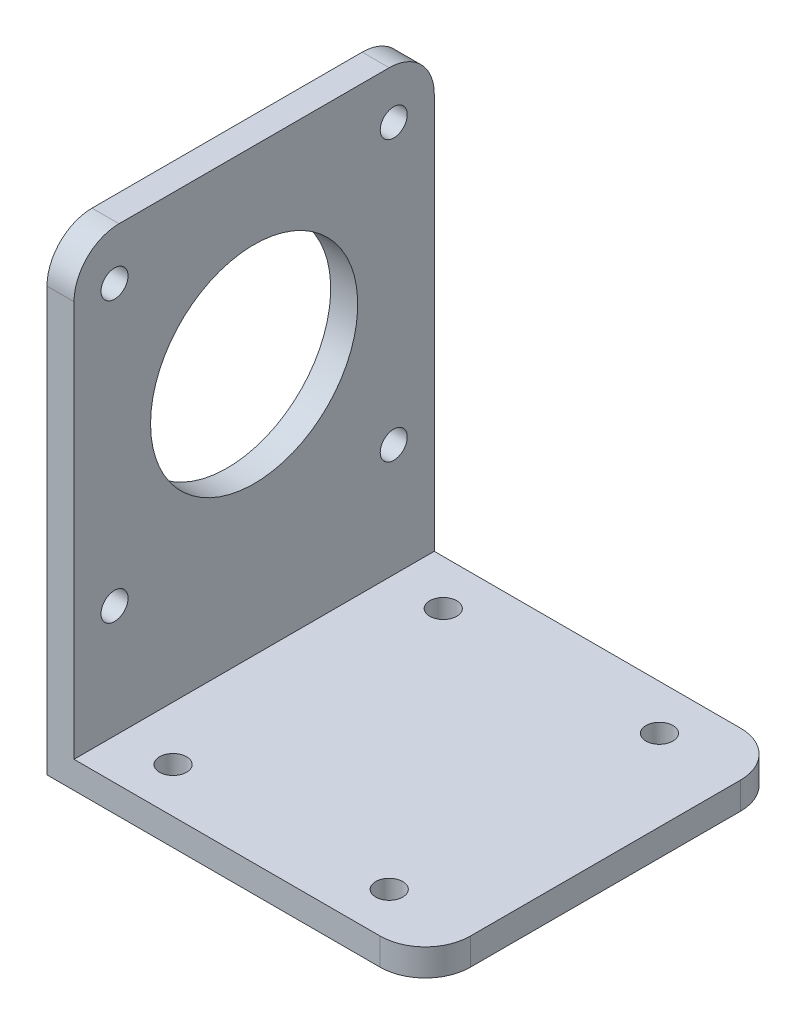
ISO-10303-21;
HEADER;
FILE_DESCRIPTION(('STEP AP214'),'2;1');
FILE_NAME('part.step','',(''),(''),'','','');
FILE_SCHEMA(('AUTOMOTIVE_DESIGN { 1 0 10303 214 1 1 1 1 }'));
ENDSEC;
DATA;
#1=APPLICATION_CONTEXT('core data for automotive mechanical design processes');
#2=APPLICATION_PROTOCOL_DEFINITION('international standard','automotive_design',2000,#1);
#3=PRODUCT_CONTEXT('',#1,'mechanical');
#4=PRODUCT('Part','Part','',(#3));
#5=PRODUCT_RELATED_PRODUCT_CATEGORY('part','',(#4));
#6=PRODUCT_DEFINITION_FORMATION('','',#4);
#7=PRODUCT_DEFINITION_CONTEXT('part definition',#1,'design');
#8=PRODUCT_DEFINITION('design','',#6,#7);
#9=PRODUCT_DEFINITION_SHAPE('','',#8);
#10=(LENGTH_UNIT() NAMED_UNIT(*) SI_UNIT(.MILLI.,.METRE.));
#11=(NAMED_UNIT(*) PLANE_ANGLE_UNIT() SI_UNIT($,.RADIAN.));
#12=(NAMED_UNIT(*) SI_UNIT($,.STERADIAN.) SOLID_ANGLE_UNIT());
#13=UNCERTAINTY_MEASURE_WITH_UNIT(LENGTH_MEASURE(1.E-05),#10,'distance_accuracy_value','');
#14=(GEOMETRIC_REPRESENTATION_CONTEXT(3) GLOBAL_UNCERTAINTY_ASSIGNED_CONTEXT((#13)) GLOBAL_UNIT_ASSIGNED_CONTEXT((#10,
#11,#12)) REPRESENTATION_CONTEXT('',''));
#15=CARTESIAN_POINT('',(0.,0.,0.));
#16=DIRECTION('',(0.,0.,1.));
#17=DIRECTION('',(1.,0.,0.));
#18=AXIS2_PLACEMENT_3D('',#15,#16,#17);
#19=CARTESIAN_POINT('',(0.,3.,0.));
#20=DIRECTION('',(0.,-1.,0.));
#21=DIRECTION('',(0.,0.,-1.));
#22=AXIS2_PLACEMENT_3D('',#19,#20,#21);
#23=PLANE('',#22);
#24=DIRECTION('',(0.,0.,-1.));
#25=VECTOR('',#24,1.);
#26=CARTESIAN_POINT('',(21.,3.,20.));
#27=LINE('',#26,#25);
#28=CARTESIAN_POINT('',(21.,3.,15.));
#29=VERTEX_POINT('',#28);
#30=CARTESIAN_POINT('',(21.,3.,-15.));
#31=VERTEX_POINT('',#30);
#32=EDGE_CURVE('E130',#29,#31,#27,.T.);
#33=ORIENTED_EDGE('',*,*,#32,.T.);
#34=CARTESIAN_POINT('',(16.,3.,-15.));
#35=DIRECTION('',(0.,-1.,0.));
#36=DIRECTION('',(0.,0.,-1.));
#37=AXIS2_PLACEMENT_3D('',#34,#35,#36);
#38=CIRCLE('',#37,5.);
#39=CARTESIAN_POINT('',(16.,3.,-20.));
#40=VERTEX_POINT('',#39);
#41=EDGE_CURVE('E49',#31,#40,#38,.F.);
#42=ORIENTED_EDGE('',*,*,#41,.T.);
#43=DIRECTION('',(-1.,0.,0.));
#44=VECTOR('',#43,1.);
#45=CARTESIAN_POINT('',(-21.,3.,-20.));
#46=LINE('',#45,#44);
#47=CARTESIAN_POINT('',(-18.,3.,-20.));
#48=VERTEX_POINT('',#47);
#49=EDGE_CURVE('E120',#40,#48,#46,.T.);
#50=ORIENTED_EDGE('',*,*,#49,.T.);
#51=DIRECTION('',(0.,0.,1.));
#52=VECTOR('',#51,1.);
#53=CARTESIAN_POINT('',(-18.,3.,-20.));
#54=LINE('',#53,#52);
#55=CARTESIAN_POINT('',(-18.,3.,20.));
#56=VERTEX_POINT('',#55);
#57=EDGE_CURVE('E124',#48,#56,#54,.T.);
#58=ORIENTED_EDGE('',*,*,#57,.T.);
#59=DIRECTION('',(1.,0.,0.));
#60=VECTOR('',#59,1.);
#61=CARTESIAN_POINT('',(-21.,3.,20.));
#62=LINE('',#61,#60);
#63=CARTESIAN_POINT('',(16.,3.,20.));
#64=VERTEX_POINT('',#63);
#65=EDGE_CURVE('E129',#56,#64,#62,.T.);
#66=ORIENTED_EDGE('',*,*,#65,.T.);
#67=CARTESIAN_POINT('',(16.,3.,15.));
#68=DIRECTION('',(0.,-1.,0.));
#69=DIRECTION('',(0.,0.,-1.));
#70=AXIS2_PLACEMENT_3D('',#67,#68,#69);
#71=CIRCLE('',#70,5.);
#72=EDGE_CURVE('E224',#64,#29,#71,.F.);
#73=ORIENTED_EDGE('',*,*,#72,.T.);
#74=EDGE_LOOP('',(#33,#42,#50,#58,#66,#73));
#75=FACE_BOUND('',#74,.T.);
#76=CARTESIAN_POINT('',(-12.,3.,-15.));
#77=DIRECTION('',(0.,1.,0.));
#78=DIRECTION('',(0.,0.,1.));
#79=AXIS2_PLACEMENT_3D('',#76,#77,#78);
#80=CIRCLE('',#79,1.5);
#81=CARTESIAN_POINT('',(-12.,3.,-13.5));
#82=VERTEX_POINT('',#81);
#83=EDGE_CURVE('E176',#82,#82,#80,.T.);
#84=ORIENTED_EDGE('',*,*,#83,.F.);
#85=EDGE_LOOP('',(#84));
#86=FACE_BOUND('',#85,.T.);
#87=CARTESIAN_POINT('',(-12.,3.,15.));
#88=DIRECTION('',(0.,1.,0.));
#89=DIRECTION('',(0.,0.,-1.));
#90=AXIS2_PLACEMENT_3D('',#87,#88,#89);
#91=CIRCLE('',#90,1.5);
#92=CARTESIAN_POINT('',(-12.,3.,13.5));
#93=VERTEX_POINT('',#92);
#94=EDGE_CURVE('E170',#93,#93,#91,.T.);
#95=ORIENTED_EDGE('',*,*,#94,.F.);
#96=EDGE_LOOP('',(#95));
#97=FACE_BOUND('',#96,.T.);
#98=CARTESIAN_POINT('',(12.,3.,15.));
#99=DIRECTION('',(0.,1.,0.));
#100=DIRECTION('',(0.,0.,1.));
#101=AXIS2_PLACEMENT_3D('',#98,#99,#100);
#102=CIRCLE('',#101,1.5);
#103=CARTESIAN_POINT('',(12.,3.,16.5));
#104=VERTEX_POINT('',#103);
#105=EDGE_CURVE('E164',#104,#104,#102,.T.);
#106=ORIENTED_EDGE('',*,*,#105,.F.);
#107=EDGE_LOOP('',(#106));
#108=FACE_BOUND('',#107,.T.);
#109=CARTESIAN_POINT('',(12.,3.,-15.));
#110=DIRECTION('',(0.,1.,0.));
#111=DIRECTION('',(0.,0.,-1.));
#112=AXIS2_PLACEMENT_3D('',#109,#110,#111);
#113=CIRCLE('',#112,1.5);
#114=CARTESIAN_POINT('',(12.,3.,-16.5));
#115=VERTEX_POINT('',#114);
#116=EDGE_CURVE('E158',#115,#115,#113,.T.);
#117=ORIENTED_EDGE('',*,*,#116,.F.);
#118=EDGE_LOOP('',(#117));
#119=FACE_BOUND('',#118,.T.);
#120=ADVANCED_FACE('F41',(#75,#86,#97,#108,#119),#23,.F.);
#121=CARTESIAN_POINT('',(0.,0.,0.));
#122=DIRECTION('',(0.,-1.,0.));
#123=DIRECTION('',(0.,0.,-1.));
#124=AXIS2_PLACEMENT_3D('',#121,#122,#123);
#125=PLANE('',#124);
#126=CARTESIAN_POINT('',(12.,0.,15.));
#127=DIRECTION('',(0.,1.,0.));
#128=DIRECTION('',(0.,0.,1.));
#129=AXIS2_PLACEMENT_3D('',#126,#127,#128);
#130=CIRCLE('',#129,1.5);
#131=CARTESIAN_POINT('',(12.,0.,16.5));
#132=VERTEX_POINT('',#131);
#133=EDGE_CURVE('E161',#132,#132,#130,.T.);
#134=ORIENTED_EDGE('',*,*,#133,.T.);
#135=EDGE_LOOP('',(#134));
#136=FACE_BOUND('',#135,.T.);
#137=CARTESIAN_POINT('',(-12.,0.,-15.));
#138=DIRECTION('',(0.,1.,0.));
#139=DIRECTION('',(0.,0.,1.));
#140=AXIS2_PLACEMENT_3D('',#137,#138,#139);
#141=CIRCLE('',#140,1.5);
#142=CARTESIAN_POINT('',(-12.,0.,-13.5));
#143=VERTEX_POINT('',#142);
#144=EDGE_CURVE('E173',#143,#143,#141,.T.);
#145=ORIENTED_EDGE('',*,*,#144,.T.);
#146=EDGE_LOOP('',(#145));
#147=FACE_BOUND('',#146,.T.);
#148=DIRECTION('',(-1.,0.,0.));
#149=VECTOR('',#148,1.);
#150=CARTESIAN_POINT('',(-21.,0.,-20.));
#151=LINE('',#150,#149);
#152=CARTESIAN_POINT('',(16.,0.,-20.));
#153=VERTEX_POINT('',#152);
#154=CARTESIAN_POINT('',(-21.,0.,-20.));
#155=VERTEX_POINT('',#154);
#156=EDGE_CURVE('E187',#153,#155,#151,.T.);
#157=ORIENTED_EDGE('',*,*,#156,.F.);
#158=CARTESIAN_POINT('',(16.,0.,-15.));
#159=DIRECTION('',(0.,-1.,0.));
#160=DIRECTION('',(0.,0.,-1.));
#161=AXIS2_PLACEMENT_3D('',#158,#159,#160);
#162=CIRCLE('',#161,5.);
#163=CARTESIAN_POINT('',(21.,0.,-15.));
#164=VERTEX_POINT('',#163);
#165=EDGE_CURVE('E218',#153,#164,#162,.T.);
#166=ORIENTED_EDGE('',*,*,#165,.T.);
#167=DIRECTION('',(0.,0.,-1.));
#168=VECTOR('',#167,1.);
#169=CARTESIAN_POINT('',(21.,0.,20.));
#170=LINE('',#169,#168);
#171=CARTESIAN_POINT('',(21.,0.,15.));
#172=VERTEX_POINT('',#171);
#173=EDGE_CURVE('E179',#172,#164,#170,.T.);
#174=ORIENTED_EDGE('',*,*,#173,.F.);
#175=CARTESIAN_POINT('',(16.,0.,15.));
#176=DIRECTION('',(0.,-1.,0.));
#177=DIRECTION('',(0.,0.,-1.));
#178=AXIS2_PLACEMENT_3D('',#175,#176,#177);
#179=CIRCLE('',#178,5.);
#180=CARTESIAN_POINT('',(16.,0.,20.));
#181=VERTEX_POINT('',#180);
#182=EDGE_CURVE('E216',#172,#181,#179,.T.);
#183=ORIENTED_EDGE('',*,*,#182,.T.);
#184=DIRECTION('',(1.,0.,0.));
#185=VECTOR('',#184,1.);
#186=CARTESIAN_POINT('',(-21.,0.,20.));
#187=LINE('',#186,#185);
#188=CARTESIAN_POINT('',(-21.,0.,20.));
#189=VERTEX_POINT('',#188);
#190=EDGE_CURVE('E182',#189,#181,#187,.T.);
#191=ORIENTED_EDGE('',*,*,#190,.F.);
#192=DIRECTION('',(0.,0.,1.));
#193=VECTOR('',#192,1.);
#194=CARTESIAN_POINT('',(-21.,0.,20.));
#195=LINE('',#194,#193);
#196=EDGE_CURVE('E189',#155,#189,#195,.T.);
#197=ORIENTED_EDGE('',*,*,#196,.F.);
#198=EDGE_LOOP('',(#157,#166,#174,#183,#191,#197));
#199=FACE_BOUND('',#198,.T.);
#200=CARTESIAN_POINT('',(-12.,0.,15.));
#201=DIRECTION('',(0.,1.,0.));
#202=DIRECTION('',(0.,0.,-1.));
#203=AXIS2_PLACEMENT_3D('',#200,#201,#202);
#204=CIRCLE('',#203,1.5);
#205=CARTESIAN_POINT('',(-12.,0.,13.5));
#206=VERTEX_POINT('',#205);
#207=EDGE_CURVE('E167',#206,#206,#204,.T.);
#208=ORIENTED_EDGE('',*,*,#207,.T.);
#209=EDGE_LOOP('',(#208));
#210=FACE_BOUND('',#209,.T.);
#211=CARTESIAN_POINT('',(12.,0.,-15.));
#212=DIRECTION('',(0.,1.,0.));
#213=DIRECTION('',(0.,0.,-1.));
#214=AXIS2_PLACEMENT_3D('',#211,#212,#213);
#215=CIRCLE('',#214,1.5);
#216=CARTESIAN_POINT('',(12.,0.,-16.5));
#217=VERTEX_POINT('',#216);
#218=EDGE_CURVE('E140',#217,#217,#215,.T.);
#219=ORIENTED_EDGE('',*,*,#218,.T.);
#220=EDGE_LOOP('',(#219));
#221=FACE_BOUND('',#220,.T.);
#222=ADVANCED_FACE('F233',(#136,#147,#199,#210,#221),#125,.T.);
#223=CARTESIAN_POINT('',(21.,3.,20.));
#224=DIRECTION('',(-1.,0.,0.));
#225=DIRECTION('',(0.,0.,1.));
#226=AXIS2_PLACEMENT_3D('',#223,#224,#225);
#227=PLANE('',#226);
#228=ORIENTED_EDGE('',*,*,#173,.T.);
#229=DIRECTION('',(0.,-1.,0.));
#230=VECTOR('',#229,1.);
#231=CARTESIAN_POINT('',(21.,3.,-15.));
#232=LINE('',#231,#230);
#233=EDGE_CURVE('E62',#164,#31,#232,.F.);
#234=ORIENTED_EDGE('',*,*,#233,.T.);
#235=ORIENTED_EDGE('',*,*,#32,.F.);
#236=DIRECTION('',(0.,-1.,0.));
#237=VECTOR('',#236,1.);
#238=CARTESIAN_POINT('',(21.,3.,15.));
#239=LINE('',#238,#237);
#240=EDGE_CURVE('E220',#29,#172,#239,.T.);
#241=ORIENTED_EDGE('',*,*,#240,.T.);
#242=EDGE_LOOP('',(#228,#234,#235,#241));
#243=FACE_BOUND('',#242,.T.);
#244=ADVANCED_FACE('F228',(#243),#227,.F.);
#245=CARTESIAN_POINT('',(-21.,3.,-20.));
#246=DIRECTION('',(0.,0.,1.));
#247=DIRECTION('',(1.,0.,0.));
#248=AXIS2_PLACEMENT_3D('',#245,#246,#247);
#249=PLANE('',#248);
#250=ORIENTED_EDGE('',*,*,#49,.F.);
#251=DIRECTION('',(0.,-1.,0.));
#252=VECTOR('',#251,1.);
#253=CARTESIAN_POINT('',(16.,3.,-20.));
#254=LINE('',#253,#252);
#255=EDGE_CURVE('E214',#40,#153,#254,.T.);
#256=ORIENTED_EDGE('',*,*,#255,.T.);
#257=ORIENTED_EDGE('',*,*,#156,.T.);
#258=DIRECTION('',(0.,-1.,0.));
#259=VECTOR('',#258,1.);
#260=CARTESIAN_POINT('',(-21.,3.,-20.));
#261=LINE('',#260,#259);
#262=CARTESIAN_POINT('',(-21.,47.,-20.));
#263=VERTEX_POINT('',#262);
#264=EDGE_CURVE('E194',#263,#155,#261,.T.);
#265=ORIENTED_EDGE('',*,*,#264,.F.);
#266=DIRECTION('',(-1.,0.,0.));
#267=VECTOR('',#266,1.);
#268=CARTESIAN_POINT('',(-18.,47.,-20.));
#269=LINE('',#268,#267);
#270=CARTESIAN_POINT('',(-18.,47.,-20.));
#271=VERTEX_POINT('',#270);
#272=EDGE_CURVE('E137',#263,#271,#269,.F.);
#273=ORIENTED_EDGE('',*,*,#272,.T.);
#274=DIRECTION('',(0.,-1.,0.));
#275=VECTOR('',#274,1.);
#276=CARTESIAN_POINT('',(-18.,3.,-20.));
#277=LINE('',#276,#275);
#278=EDGE_CURVE('E133',#271,#48,#277,.T.);
#279=ORIENTED_EDGE('',*,*,#278,.T.);
#280=EDGE_LOOP('',(#250,#256,#257,#265,#273,#279));
#281=FACE_BOUND('',#280,.T.);
#282=ADVANCED_FACE('F134',(#281),#249,.F.);
#283=CARTESIAN_POINT('',(-21.,3.,20.));
#284=DIRECTION('',(1.,0.,0.));
#285=DIRECTION('',(0.,0.,-1.));
#286=AXIS2_PLACEMENT_3D('',#283,#284,#285);
#287=PLANE('',#286);
#288=DIRECTION('',(0.,0.,-1.));
#289=VECTOR('',#288,1.);
#290=CARTESIAN_POINT('',(-21.,52.,-20.));
#291=LINE('',#290,#289);
#292=CARTESIAN_POINT('',(-21.,52.,15.));
#293=VERTEX_POINT('',#292);
#294=CARTESIAN_POINT('',(-21.,52.,-15.));
#295=VERTEX_POINT('',#294);
#296=EDGE_CURVE('E146',#293,#295,#291,.T.);
#297=ORIENTED_EDGE('',*,*,#296,.T.);
#298=CARTESIAN_POINT('',(-21.,47.,-15.));
#299=DIRECTION('',(1.,0.,0.));
#300=DIRECTION('',(0.,0.,-1.));
#301=AXIS2_PLACEMENT_3D('',#298,#299,#300);
#302=CIRCLE('',#301,5.);
#303=EDGE_CURVE('E204',#295,#263,#302,.F.);
#304=ORIENTED_EDGE('',*,*,#303,.T.);
#305=ORIENTED_EDGE('',*,*,#264,.T.);
#306=ORIENTED_EDGE('',*,*,#196,.T.);
#307=DIRECTION('',(0.,-1.,0.));
#308=VECTOR('',#307,1.);
#309=CARTESIAN_POINT('',(-21.,3.,20.));
#310=LINE('',#309,#308);
#311=CARTESIAN_POINT('',(-21.,47.,20.));
#312=VERTEX_POINT('',#311);
#313=EDGE_CURVE('E185',#312,#189,#310,.T.);
#314=ORIENTED_EDGE('',*,*,#313,.F.);
#315=CARTESIAN_POINT('',(-21.,47.,15.));
#316=DIRECTION('',(1.,0.,0.));
#317=DIRECTION('',(0.,0.,-1.));
#318=AXIS2_PLACEMENT_3D('',#315,#316,#317);
#319=CIRCLE('',#318,5.);
#320=EDGE_CURVE('E202',#312,#293,#319,.F.);
#321=ORIENTED_EDGE('',*,*,#320,.T.);
#322=EDGE_LOOP('',(#297,#304,#305,#306,#314,#321));
#323=FACE_BOUND('',#322,.T.);
#324=CARTESIAN_POINT('',(-21.,46.5,15.5));
#325=DIRECTION('',(-1.,0.,0.));
#326=DIRECTION('',(0.,0.,-1.));
#327=AXIS2_PLACEMENT_3D('',#324,#325,#326);
#328=CIRCLE('',#327,1.5);
#329=CARTESIAN_POINT('',(-21.,46.5,14.));
#330=VERTEX_POINT('',#329);
#331=EDGE_CURVE('E462',#330,#330,#328,.T.);
#332=ORIENTED_EDGE('',*,*,#331,.F.);
#333=EDGE_LOOP('',(#332));
#334=FACE_BOUND('',#333,.T.);
#335=CARTESIAN_POINT('',(-21.,15.5,15.5));
#336=DIRECTION('',(-1.,0.,0.));
#337=DIRECTION('',(0.,0.,-1.));
#338=AXIS2_PLACEMENT_3D('',#335,#336,#337);
#339=CIRCLE('',#338,1.5);
#340=CARTESIAN_POINT('',(-21.,15.5,14.));
#341=VERTEX_POINT('',#340);
#342=EDGE_CURVE('E455',#341,#341,#339,.T.);
#343=ORIENTED_EDGE('',*,*,#342,.F.);
#344=EDGE_LOOP('',(#343));
#345=FACE_BOUND('',#344,.T.);
#346=CARTESIAN_POINT('',(-21.,15.5,-15.5));
#347=DIRECTION('',(-1.,0.,0.));
#348=DIRECTION('',(0.,0.,1.));
#349=AXIS2_PLACEMENT_3D('',#346,#347,#348);
#350=CIRCLE('',#349,1.5);
#351=CARTESIAN_POINT('',(-21.,15.5,-14.));
#352=VERTEX_POINT('',#351);
#353=EDGE_CURVE('E459',#352,#352,#350,.T.);
#354=ORIENTED_EDGE('',*,*,#353,.F.);
#355=EDGE_LOOP('',(#354));
#356=FACE_BOUND('',#355,.T.);
#357=CARTESIAN_POINT('',(-21.,46.5,-15.5));
#358=DIRECTION('',(-1.,0.,0.));
#359=DIRECTION('',(0.,0.,1.));
#360=AXIS2_PLACEMENT_3D('',#357,#358,#359);
#361=CIRCLE('',#360,1.5);
#362=CARTESIAN_POINT('',(-21.,46.5,-14.));
#363=VERTEX_POINT('',#362);
#364=EDGE_CURVE('E469',#363,#363,#361,.T.);
#365=ORIENTED_EDGE('',*,*,#364,.F.);
#366=EDGE_LOOP('',(#365));
#367=FACE_BOUND('',#366,.T.);
#368=CARTESIAN_POINT('',(-21.,31.,0.));
#369=DIRECTION('',(-1.,0.,0.));
#370=DIRECTION('',(0.,0.,1.));
#371=AXIS2_PLACEMENT_3D('',#368,#369,#370);
#372=CIRCLE('',#371,11.5);
#373=CARTESIAN_POINT('',(-21.,31.,11.5));
#374=VERTEX_POINT('',#373);
#375=EDGE_CURVE('E153',#374,#374,#372,.T.);
#376=ORIENTED_EDGE('',*,*,#375,.F.);
#377=EDGE_LOOP('',(#376));
#378=FACE_BOUND('',#377,.T.);
#379=ADVANCED_FACE('F240',(#323,#334,#345,#356,#367,#378),#287,.F.);
#380=CARTESIAN_POINT('',(-21.,3.,20.));
#381=DIRECTION('',(0.,0.,-1.));
#382=DIRECTION('',(-1.,0.,0.));
#383=AXIS2_PLACEMENT_3D('',#380,#381,#382);
#384=PLANE('',#383);
#385=ORIENTED_EDGE('',*,*,#190,.T.);
#386=DIRECTION('',(0.,-1.,0.));
#387=VECTOR('',#386,1.);
#388=CARTESIAN_POINT('',(16.,3.,20.));
#389=LINE('',#388,#387);
#390=EDGE_CURVE('E11',#181,#64,#389,.F.);
#391=ORIENTED_EDGE('',*,*,#390,.T.);
#392=ORIENTED_EDGE('',*,*,#65,.F.);
#393=DIRECTION('',(0.,1.,0.));
#394=VECTOR('',#393,1.);
#395=CARTESIAN_POINT('',(-18.,52.,20.));
#396=LINE('',#395,#394);
#397=CARTESIAN_POINT('',(-18.,47.,20.));
#398=VERTEX_POINT('',#397);
#399=EDGE_CURVE('E145',#56,#398,#396,.T.);
#400=ORIENTED_EDGE('',*,*,#399,.T.);
#401=DIRECTION('',(-1.,0.,0.));
#402=VECTOR('',#401,1.);
#403=CARTESIAN_POINT('',(-21.,47.,20.));
#404=LINE('',#403,#402);
#405=EDGE_CURVE('E211',#398,#312,#404,.T.);
#406=ORIENTED_EDGE('',*,*,#405,.T.);
#407=ORIENTED_EDGE('',*,*,#313,.T.);
#408=EDGE_LOOP('',(#385,#391,#392,#400,#406,#407));
#409=FACE_BOUND('',#408,.T.);
#410=ADVANCED_FACE('F236',(#409),#384,.F.);
#411=CARTESIAN_POINT('',(-12.,3.,-15.));
#412=DIRECTION('',(0.,-1.,0.));
#413=DIRECTION('',(0.,0.,-1.));
#414=AXIS2_PLACEMENT_3D('',#411,#412,#413);
#415=CYLINDRICAL_SURFACE('',#414,1.5);
#416=ORIENTED_EDGE('',*,*,#83,.T.);
#417=EDGE_LOOP('',(#416));
#418=FACE_BOUND('',#417,.T.);
#419=ORIENTED_EDGE('',*,*,#144,.F.);
#420=EDGE_LOOP('',(#419));
#421=FACE_BOUND('',#420,.T.);
#422=ADVANCED_FACE('F262',(#418,#421),#415,.F.);
#423=CARTESIAN_POINT('',(-12.,3.,15.));
#424=DIRECTION('',(0.,-1.,0.));
#425=DIRECTION('',(0.,0.,-1.));
#426=AXIS2_PLACEMENT_3D('',#423,#424,#425);
#427=CYLINDRICAL_SURFACE('',#426,1.5);
#428=ORIENTED_EDGE('',*,*,#94,.T.);
#429=EDGE_LOOP('',(#428));
#430=FACE_BOUND('',#429,.T.);
#431=ORIENTED_EDGE('',*,*,#207,.F.);
#432=EDGE_LOOP('',(#431));
#433=FACE_BOUND('',#432,.T.);
#434=ADVANCED_FACE('F304',(#430,#433),#427,.F.);
#435=CARTESIAN_POINT('',(12.,3.,15.));
#436=DIRECTION('',(0.,-1.,0.));
#437=DIRECTION('',(0.,0.,-1.));
#438=AXIS2_PLACEMENT_3D('',#435,#436,#437);
#439=CYLINDRICAL_SURFACE('',#438,1.5);
#440=ORIENTED_EDGE('',*,*,#105,.T.);
#441=EDGE_LOOP('',(#440));
#442=FACE_BOUND('',#441,.T.);
#443=ORIENTED_EDGE('',*,*,#133,.F.);
#444=EDGE_LOOP('',(#443));
#445=FACE_BOUND('',#444,.T.);
#446=ADVANCED_FACE('F298',(#442,#445),#439,.F.);
#447=CARTESIAN_POINT('',(12.,3.,-15.));
#448=DIRECTION('',(0.,-1.,0.));
#449=DIRECTION('',(0.,0.,-1.));
#450=AXIS2_PLACEMENT_3D('',#447,#448,#449);
#451=CYLINDRICAL_SURFACE('',#450,1.5);
#452=ORIENTED_EDGE('',*,*,#116,.T.);
#453=EDGE_LOOP('',(#452));
#454=FACE_BOUND('',#453,.T.);
#455=ORIENTED_EDGE('',*,*,#218,.F.);
#456=EDGE_LOOP('',(#455));
#457=FACE_BOUND('',#456,.T.);
#458=ADVANCED_FACE('F290',(#454,#457),#451,.F.);
#459=CARTESIAN_POINT('',(-18.,52.,-20.));
#460=DIRECTION('',(0.,1.,0.));
#461=DIRECTION('',(0.,0.,1.));
#462=AXIS2_PLACEMENT_3D('',#459,#460,#461);
#463=PLANE('',#462);
#464=DIRECTION('',(0.,0.,-1.));
#465=VECTOR('',#464,1.);
#466=CARTESIAN_POINT('',(-18.,52.,-20.));
#467=LINE('',#466,#465);
#468=CARTESIAN_POINT('',(-18.,52.,15.));
#469=VERTEX_POINT('',#468);
#470=CARTESIAN_POINT('',(-18.,52.,-15.));
#471=VERTEX_POINT('',#470);
#472=EDGE_CURVE('E141',#469,#471,#467,.T.);
#473=ORIENTED_EDGE('',*,*,#472,.T.);
#474=DIRECTION('',(-1.,0.,0.));
#475=VECTOR('',#474,1.);
#476=CARTESIAN_POINT('',(-21.,52.,-15.));
#477=LINE('',#476,#475);
#478=EDGE_CURVE('E199',#471,#295,#477,.T.);
#479=ORIENTED_EDGE('',*,*,#478,.T.);
#480=ORIENTED_EDGE('',*,*,#296,.F.);
#481=DIRECTION('',(-1.,0.,0.));
#482=VECTOR('',#481,1.);
#483=CARTESIAN_POINT('',(-18.,52.,15.));
#484=LINE('',#483,#482);
#485=EDGE_CURVE('E197',#293,#469,#484,.F.);
#486=ORIENTED_EDGE('',*,*,#485,.T.);
#487=EDGE_LOOP('',(#473,#479,#480,#486));
#488=FACE_BOUND('',#487,.T.);
#489=ADVANCED_FACE('F286',(#488),#463,.T.);
#490=CARTESIAN_POINT('',(-18.,0.,0.));
#491=DIRECTION('',(1.,0.,0.));
#492=DIRECTION('',(0.,0.,-1.));
#493=AXIS2_PLACEMENT_3D('',#490,#491,#492);
#494=PLANE('',#493);
#495=CARTESIAN_POINT('',(-18.,46.5,15.5));
#496=DIRECTION('',(-1.,0.,0.));
#497=DIRECTION('',(0.,0.,-1.));
#498=AXIS2_PLACEMENT_3D('',#495,#496,#497);
#499=CIRCLE('',#498,1.5);
#500=CARTESIAN_POINT('',(-18.,46.5,14.));
#501=VERTEX_POINT('',#500);
#502=EDGE_CURVE('E457',#501,#501,#499,.T.);
#503=ORIENTED_EDGE('',*,*,#502,.T.);
#504=EDGE_LOOP('',(#503));
#505=FACE_BOUND('',#504,.T.);
#506=CARTESIAN_POINT('',(-18.,15.5,15.5));
#507=DIRECTION('',(-1.,0.,0.));
#508=DIRECTION('',(0.,0.,-1.));
#509=AXIS2_PLACEMENT_3D('',#506,#507,#508);
#510=CIRCLE('',#509,1.5);
#511=CARTESIAN_POINT('',(-18.,15.5,14.));
#512=VERTEX_POINT('',#511);
#513=EDGE_CURVE('E452',#512,#512,#510,.T.);
#514=ORIENTED_EDGE('',*,*,#513,.T.);
#515=EDGE_LOOP('',(#514));
#516=FACE_BOUND('',#515,.T.);
#517=CARTESIAN_POINT('',(-18.,15.5,-15.5));
#518=DIRECTION('',(-1.,0.,0.));
#519=DIRECTION('',(0.,0.,1.));
#520=AXIS2_PLACEMENT_3D('',#517,#518,#519);
#521=CIRCLE('',#520,1.5);
#522=CARTESIAN_POINT('',(-18.,15.5,-14.));
#523=VERTEX_POINT('',#522);
#524=EDGE_CURVE('E466',#523,#523,#521,.T.);
#525=ORIENTED_EDGE('',*,*,#524,.T.);
#526=EDGE_LOOP('',(#525));
#527=FACE_BOUND('',#526,.T.);
#528=CARTESIAN_POINT('',(-18.,46.5,-15.5));
#529=DIRECTION('',(-1.,0.,0.));
#530=DIRECTION('',(0.,0.,1.));
#531=AXIS2_PLACEMENT_3D('',#528,#529,#530);
#532=CIRCLE('',#531,1.5);
#533=CARTESIAN_POINT('',(-18.,46.5,-14.));
#534=VERTEX_POINT('',#533);
#535=EDGE_CURVE('E472',#534,#534,#532,.T.);
#536=ORIENTED_EDGE('',*,*,#535,.T.);
#537=EDGE_LOOP('',(#536));
#538=FACE_BOUND('',#537,.T.);
#539=CARTESIAN_POINT('',(-18.,31.,0.));
#540=DIRECTION('',(-1.,0.,0.));
#541=DIRECTION('',(0.,0.,1.));
#542=AXIS2_PLACEMENT_3D('',#539,#540,#541);
#543=CIRCLE('',#542,11.5);
#544=CARTESIAN_POINT('',(-18.,31.,11.5));
#545=VERTEX_POINT('',#544);
#546=EDGE_CURVE('E150',#545,#545,#543,.T.);
#547=ORIENTED_EDGE('',*,*,#546,.T.);
#548=EDGE_LOOP('',(#547));
#549=FACE_BOUND('',#548,.T.);
#550=ORIENTED_EDGE('',*,*,#278,.F.);
#551=CARTESIAN_POINT('',(-18.,47.,-15.));
#552=DIRECTION('',(1.,0.,0.));
#553=DIRECTION('',(0.,0.,-1.));
#554=AXIS2_PLACEMENT_3D('',#551,#552,#553);
#555=CIRCLE('',#554,5.);
#556=EDGE_CURVE('E209',#271,#471,#555,.T.);
#557=ORIENTED_EDGE('',*,*,#556,.T.);
#558=ORIENTED_EDGE('',*,*,#472,.F.);
#559=CARTESIAN_POINT('',(-18.,47.,15.));
#560=DIRECTION('',(1.,0.,0.));
#561=DIRECTION('',(0.,0.,-1.));
#562=AXIS2_PLACEMENT_3D('',#559,#560,#561);
#563=CIRCLE('',#562,5.);
#564=EDGE_CURVE('E207',#469,#398,#563,.T.);
#565=ORIENTED_EDGE('',*,*,#564,.T.);
#566=ORIENTED_EDGE('',*,*,#399,.F.);
#567=ORIENTED_EDGE('',*,*,#57,.F.);
#568=EDGE_LOOP('',(#550,#557,#558,#565,#566,#567));
#569=FACE_BOUND('',#568,.T.);
#570=ADVANCED_FACE('F143',(#505,#516,#527,#538,#549,#569),#494,.T.);
#571=CARTESIAN_POINT('',(-18.,31.,0.));
#572=DIRECTION('',(-1.,0.,0.));
#573=DIRECTION('',(0.,0.,1.));
#574=AXIS2_PLACEMENT_3D('',#571,#572,#573);
#575=CYLINDRICAL_SURFACE('',#574,11.5);
#576=ORIENTED_EDGE('',*,*,#546,.F.);
#577=EDGE_LOOP('',(#576));
#578=FACE_BOUND('',#577,.T.);
#579=ORIENTED_EDGE('',*,*,#375,.T.);
#580=EDGE_LOOP('',(#579));
#581=FACE_BOUND('',#580,.T.);
#582=ADVANCED_FACE('F294',(#578,#581),#575,.F.);
#583=CARTESIAN_POINT('',(-18.,46.5,-15.5));
#584=DIRECTION('',(-1.,0.,0.));
#585=DIRECTION('',(0.,0.,1.));
#586=AXIS2_PLACEMENT_3D('',#583,#584,#585);
#587=CYLINDRICAL_SURFACE('',#586,1.5);
#588=ORIENTED_EDGE('',*,*,#535,.F.);
#589=EDGE_LOOP('',(#588));
#590=FACE_BOUND('',#589,.T.);
#591=ORIENTED_EDGE('',*,*,#364,.T.);
#592=EDGE_LOOP('',(#591));
#593=FACE_BOUND('',#592,.T.);
#594=ADVANCED_FACE('F392',(#590,#593),#587,.F.);
#595=CARTESIAN_POINT('',(-18.,15.5,-15.5));
#596=DIRECTION('',(-1.,0.,0.));
#597=DIRECTION('',(0.,0.,1.));
#598=AXIS2_PLACEMENT_3D('',#595,#596,#597);
#599=CYLINDRICAL_SURFACE('',#598,1.5);
#600=ORIENTED_EDGE('',*,*,#524,.F.);
#601=EDGE_LOOP('',(#600));
#602=FACE_BOUND('',#601,.T.);
#603=ORIENTED_EDGE('',*,*,#353,.T.);
#604=EDGE_LOOP('',(#603));
#605=FACE_BOUND('',#604,.T.);
#606=ADVANCED_FACE('F401',(#602,#605),#599,.F.);
#607=CARTESIAN_POINT('',(-18.,15.5,15.5));
#608=DIRECTION('',(-1.,0.,0.));
#609=DIRECTION('',(0.,0.,1.));
#610=AXIS2_PLACEMENT_3D('',#607,#608,#609);
#611=CYLINDRICAL_SURFACE('',#610,1.5);
#612=ORIENTED_EDGE('',*,*,#513,.F.);
#613=EDGE_LOOP('',(#612));
#614=FACE_BOUND('',#613,.T.);
#615=ORIENTED_EDGE('',*,*,#342,.T.);
#616=EDGE_LOOP('',(#615));
#617=FACE_BOUND('',#616,.T.);
#618=ADVANCED_FACE('F279',(#614,#617),#611,.F.);
#619=CARTESIAN_POINT('',(-18.,46.5,15.5));
#620=DIRECTION('',(-1.,0.,0.));
#621=DIRECTION('',(0.,0.,1.));
#622=AXIS2_PLACEMENT_3D('',#619,#620,#621);
#623=CYLINDRICAL_SURFACE('',#622,1.5);
#624=ORIENTED_EDGE('',*,*,#502,.F.);
#625=EDGE_LOOP('',(#624));
#626=FACE_BOUND('',#625,.T.);
#627=ORIENTED_EDGE('',*,*,#331,.T.);
#628=EDGE_LOOP('',(#627));
#629=FACE_BOUND('',#628,.T.);
#630=ADVANCED_FACE('F273',(#626,#629),#623,.F.);
#631=CARTESIAN_POINT('',(-18.,47.,-15.));
#632=DIRECTION('',(1.,0.,0.));
#633=DIRECTION('',(0.,0.,-1.));
#634=AXIS2_PLACEMENT_3D('',#631,#632,#633);
#635=CYLINDRICAL_SURFACE('',#634,5.);
#636=ORIENTED_EDGE('',*,*,#556,.F.);
#637=ORIENTED_EDGE('',*,*,#272,.F.);
#638=ORIENTED_EDGE('',*,*,#303,.F.);
#639=ORIENTED_EDGE('',*,*,#478,.F.);
#640=EDGE_LOOP('',(#636,#637,#638,#639));
#641=FACE_BOUND('',#640,.T.);
#642=ADVANCED_FACE('F251',(#641),#635,.T.);
#643=CARTESIAN_POINT('',(-21.,47.,15.));
#644=DIRECTION('',(1.,0.,0.));
#645=DIRECTION('',(0.,0.,-1.));
#646=AXIS2_PLACEMENT_3D('',#643,#644,#645);
#647=CYLINDRICAL_SURFACE('',#646,5.);
#648=ORIENTED_EDGE('',*,*,#564,.F.);
#649=ORIENTED_EDGE('',*,*,#485,.F.);
#650=ORIENTED_EDGE('',*,*,#320,.F.);
#651=ORIENTED_EDGE('',*,*,#405,.F.);
#652=EDGE_LOOP('',(#648,#649,#650,#651));
#653=FACE_BOUND('',#652,.T.);
#654=ADVANCED_FACE('F245',(#653),#647,.T.);
#655=CARTESIAN_POINT('',(16.,3.,-15.));
#656=DIRECTION('',(0.,-1.,0.));
#657=DIRECTION('',(0.,0.,-1.));
#658=AXIS2_PLACEMENT_3D('',#655,#656,#657);
#659=CYLINDRICAL_SURFACE('',#658,5.);
#660=ORIENTED_EDGE('',*,*,#41,.F.);
#661=ORIENTED_EDGE('',*,*,#233,.F.);
#662=ORIENTED_EDGE('',*,*,#165,.F.);
#663=ORIENTED_EDGE('',*,*,#255,.F.);
#664=EDGE_LOOP('',(#660,#661,#662,#663));
#665=FACE_BOUND('',#664,.T.);
#666=ADVANCED_FACE('F243',(#665),#659,.T.);
#667=CARTESIAN_POINT('',(16.,3.,15.));
#668=DIRECTION('',(0.,-1.,0.));
#669=DIRECTION('',(0.,0.,-1.));
#670=AXIS2_PLACEMENT_3D('',#667,#668,#669);
#671=CYLINDRICAL_SURFACE('',#670,5.);
#672=ORIENTED_EDGE('',*,*,#72,.F.);
#673=ORIENTED_EDGE('',*,*,#390,.F.);
#674=ORIENTED_EDGE('',*,*,#182,.F.);
#675=ORIENTED_EDGE('',*,*,#240,.F.);
#676=EDGE_LOOP('',(#672,#673,#674,#675));
#677=FACE_BOUND('',#676,.T.);
#678=ADVANCED_FACE('F43',(#677),#671,.T.);
#679=CLOSED_SHELL('',(#120,#222,#244,#282,#379,#410,#422,#434,#446,#458,#489,#570,#582,#594,
#606,#618,#630,#642,#654,#666,#678));
#680=MANIFOLD_SOLID_BREP('B2',#679);
#681=ADVANCED_BREP_SHAPE_REPRESENTATION('',(#18,#680),#14);
#682=SHAPE_DEFINITION_REPRESENTATION(#9,#681);
ENDSEC;
END-ISO-10303-21;
